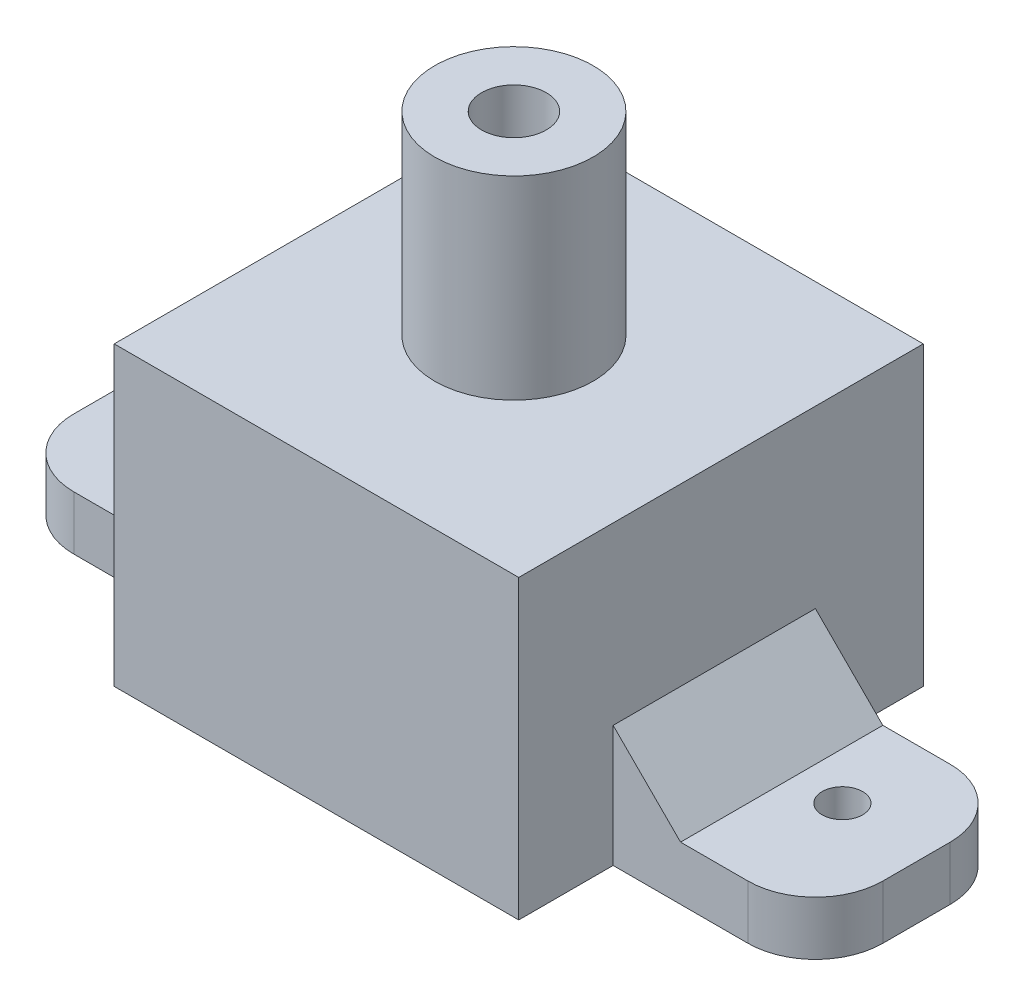
ISO-10303-21;
HEADER;
FILE_DESCRIPTION(('STEP AP214'),'2;1');
FILE_NAME('part.step','',(''),(''),'','','');
FILE_SCHEMA(('AUTOMOTIVE_DESIGN { 1 0 10303 214 1 1 1 1 }'));
ENDSEC;
DATA;
#1=APPLICATION_CONTEXT('core data for automotive mechanical design processes');
#2=APPLICATION_PROTOCOL_DEFINITION('international standard','automotive_design',2000,#1);
#3=PRODUCT_CONTEXT('',#1,'mechanical');
#4=PRODUCT('Part','Part','',(#3));
#5=PRODUCT_RELATED_PRODUCT_CATEGORY('part','',(#4));
#6=PRODUCT_DEFINITION_FORMATION('','',#4);
#7=PRODUCT_DEFINITION_CONTEXT('part definition',#1,'design');
#8=PRODUCT_DEFINITION('design','',#6,#7);
#9=PRODUCT_DEFINITION_SHAPE('','',#8);
#10=(LENGTH_UNIT() NAMED_UNIT(*) SI_UNIT(.MILLI.,.METRE.));
#11=(NAMED_UNIT(*) PLANE_ANGLE_UNIT() SI_UNIT($,.RADIAN.));
#12=(NAMED_UNIT(*) SI_UNIT($,.STERADIAN.) SOLID_ANGLE_UNIT());
#13=UNCERTAINTY_MEASURE_WITH_UNIT(LENGTH_MEASURE(1.E-05),#10,'distance_accuracy_value','');
#14=(GEOMETRIC_REPRESENTATION_CONTEXT(3) GLOBAL_UNCERTAINTY_ASSIGNED_CONTEXT((#13)) GLOBAL_UNIT_ASSIGNED_CONTEXT((#10,
#11,#12)) REPRESENTATION_CONTEXT('',''));
#15=CARTESIAN_POINT('',(0.,0.,0.));
#16=DIRECTION('',(0.,0.,1.));
#17=DIRECTION('',(1.,0.,0.));
#18=AXIS2_PLACEMENT_3D('',#15,#16,#17);
#19=CARTESIAN_POINT('',(-14.2865305436927,22.,-14.6432652718463));
#20=DIRECTION('',(1.,0.,0.));
#21=DIRECTION('',(0.,0.,-1.));
#22=AXIS2_PLACEMENT_3D('',#19,#20,#21);
#23=PLANE('',#22);
#24=DIRECTION('',(0.,0.,1.));
#25=VECTOR('',#24,1.);
#26=CARTESIAN_POINT('',(-14.2865305436927,9.00000000000004,-14.6432652718463));
#27=LINE('',#26,#25);
#28=CARTESIAN_POINT('',(-14.2865305436927,9.00000000000004,-6.64326527184634));
#29=VERTEX_POINT('',#28);
#30=CARTESIAN_POINT('',(-14.2865305436927,9.00000000000004,8.35673472815366));
#31=VERTEX_POINT('',#30);
#32=EDGE_CURVE('E378',#29,#31,#27,.T.);
#33=ORIENTED_EDGE('',*,*,#32,.T.);
#34=DIRECTION('',(0.,-1.,0.));
#35=VECTOR('',#34,1.);
#36=CARTESIAN_POINT('',(-14.2865305436927,4.,8.35673472815366));
#37=LINE('',#36,#35);
#38=CARTESIAN_POINT('',(-14.2865305436927,0.,8.35673472815366));
#39=VERTEX_POINT('',#38);
#40=EDGE_CURVE('E248',#31,#39,#37,.T.);
#41=ORIENTED_EDGE('',*,*,#40,.T.);
#42=DIRECTION('',(0.,0.,1.));
#43=VECTOR('',#42,1.);
#44=CARTESIAN_POINT('',(-14.2865305436927,0.,-14.6432652718463));
#45=LINE('',#44,#43);
#46=CARTESIAN_POINT('',(-14.2865305436927,0.,15.3567347281537));
#47=VERTEX_POINT('',#46);
#48=EDGE_CURVE('E308',#39,#47,#45,.T.);
#49=ORIENTED_EDGE('',*,*,#48,.T.);
#50=DIRECTION('',(0.,-1.,0.));
#51=VECTOR('',#50,1.);
#52=CARTESIAN_POINT('',(-14.2865305436927,22.,15.3567347281537));
#53=LINE('',#52,#51);
#54=CARTESIAN_POINT('',(-14.2865305436927,22.,15.3567347281537));
#55=VERTEX_POINT('',#54);
#56=EDGE_CURVE('E314',#55,#47,#53,.T.);
#57=ORIENTED_EDGE('',*,*,#56,.F.);
#58=DIRECTION('',(0.,0.,1.));
#59=VECTOR('',#58,1.);
#60=CARTESIAN_POINT('',(-14.2865305436927,22.,-14.6432652718463));
#61=LINE('',#60,#59);
#62=CARTESIAN_POINT('',(-14.2865305436927,22.,-14.6432652718463));
#63=VERTEX_POINT('',#62);
#64=EDGE_CURVE('E315',#63,#55,#61,.T.);
#65=ORIENTED_EDGE('',*,*,#64,.F.);
#66=DIRECTION('',(0.,-1.,0.));
#67=VECTOR('',#66,1.);
#68=CARTESIAN_POINT('',(-14.2865305436927,22.,-14.6432652718463));
#69=LINE('',#68,#67);
#70=CARTESIAN_POINT('',(-14.2865305436927,0.,-14.6432652718463));
#71=VERTEX_POINT('',#70);
#72=EDGE_CURVE('E329',#63,#71,#69,.T.);
#73=ORIENTED_EDGE('',*,*,#72,.T.);
#74=CARTESIAN_POINT('',(-14.2865305436927,0.,-6.64326527184634));
#75=VERTEX_POINT('',#74);
#76=EDGE_CURVE('E330',#71,#75,#45,.T.);
#77=ORIENTED_EDGE('',*,*,#76,.T.);
#78=DIRECTION('',(0.,-1.,0.));
#79=VECTOR('',#78,1.);
#80=CARTESIAN_POINT('',(-14.2865305436927,4.,-6.64326527184634));
#81=LINE('',#80,#79);
#82=EDGE_CURVE('E265',#29,#75,#81,.T.);
#83=ORIENTED_EDGE('',*,*,#82,.F.);
#84=EDGE_LOOP('',(#33,#41,#49,#57,#65,#73,#77,#83));
#85=FACE_BOUND('',#84,.T.);
#86=ADVANCED_FACE('F47',(#85),#23,.F.);
#87=CARTESIAN_POINT('',(15.7134694563073,22.,-14.6432652718463));
#88=DIRECTION('',(-1.,0.,0.));
#89=DIRECTION('',(0.,0.,1.));
#90=AXIS2_PLACEMENT_3D('',#87,#88,#89);
#91=PLANE('',#90);
#92=DIRECTION('',(0.,0.,-1.));
#93=VECTOR('',#92,1.);
#94=CARTESIAN_POINT('',(15.7134694563073,9.00000000000004,-14.6432652718463));
#95=LINE('',#94,#93);
#96=CARTESIAN_POINT('',(15.7134694563073,9.00000000000004,8.35673472815366));
#97=VERTEX_POINT('',#96);
#98=CARTESIAN_POINT('',(15.7134694563073,9.00000000000004,-6.64326527184634));
#99=VERTEX_POINT('',#98);
#100=EDGE_CURVE('E313',#97,#99,#95,.T.);
#101=ORIENTED_EDGE('',*,*,#100,.T.);
#102=DIRECTION('',(0.,-1.,0.));
#103=VECTOR('',#102,1.);
#104=CARTESIAN_POINT('',(15.7134694563073,4.,-6.64326527184634));
#105=LINE('',#104,#103);
#106=CARTESIAN_POINT('',(15.7134694563073,0.,-6.64326527184634));
#107=VERTEX_POINT('',#106);
#108=EDGE_CURVE('E195',#99,#107,#105,.T.);
#109=ORIENTED_EDGE('',*,*,#108,.T.);
#110=DIRECTION('',(0.,0.,-1.));
#111=VECTOR('',#110,1.);
#112=CARTESIAN_POINT('',(15.7134694563073,0.,-14.6432652718463));
#113=LINE('',#112,#111);
#114=CARTESIAN_POINT('',(15.7134694563073,0.,-14.6432652718463));
#115=VERTEX_POINT('',#114);
#116=EDGE_CURVE('E337',#107,#115,#113,.T.);
#117=ORIENTED_EDGE('',*,*,#116,.T.);
#118=DIRECTION('',(0.,-1.,0.));
#119=VECTOR('',#118,1.);
#120=CARTESIAN_POINT('',(15.7134694563073,22.,-14.6432652718463));
#121=LINE('',#120,#119);
#122=CARTESIAN_POINT('',(15.7134694563073,22.,-14.6432652718463));
#123=VERTEX_POINT('',#122);
#124=EDGE_CURVE('E347',#123,#115,#121,.T.);
#125=ORIENTED_EDGE('',*,*,#124,.F.);
#126=DIRECTION('',(0.,0.,-1.));
#127=VECTOR('',#126,1.);
#128=CARTESIAN_POINT('',(15.7134694563073,22.,-14.6432652718463));
#129=LINE('',#128,#127);
#130=CARTESIAN_POINT('',(15.7134694563073,22.,15.3567347281537));
#131=VERTEX_POINT('',#130);
#132=EDGE_CURVE('E323',#131,#123,#129,.T.);
#133=ORIENTED_EDGE('',*,*,#132,.F.);
#134=DIRECTION('',(0.,-1.,0.));
#135=VECTOR('',#134,1.);
#136=CARTESIAN_POINT('',(15.7134694563073,22.,15.3567347281537));
#137=LINE('',#136,#135);
#138=CARTESIAN_POINT('',(15.7134694563073,0.,15.3567347281537));
#139=VERTEX_POINT('',#138);
#140=EDGE_CURVE('E351',#131,#139,#137,.T.);
#141=ORIENTED_EDGE('',*,*,#140,.T.);
#142=CARTESIAN_POINT('',(15.7134694563073,0.,8.35673472815366));
#143=VERTEX_POINT('',#142);
#144=EDGE_CURVE('E338',#139,#143,#113,.T.);
#145=ORIENTED_EDGE('',*,*,#144,.T.);
#146=DIRECTION('',(0.,-1.,0.));
#147=VECTOR('',#146,1.);
#148=CARTESIAN_POINT('',(15.7134694563073,4.,8.35673472815366));
#149=LINE('',#148,#147);
#150=EDGE_CURVE('E233',#97,#143,#149,.T.);
#151=ORIENTED_EDGE('',*,*,#150,.F.);
#152=EDGE_LOOP('',(#101,#109,#117,#125,#133,#141,#145,#151));
#153=FACE_BOUND('',#152,.T.);
#154=ADVANCED_FACE('F428',(#153),#91,.F.);
#155=CARTESIAN_POINT('',(-14.2865305436927,22.,15.3567347281537));
#156=DIRECTION('',(0.,0.,-1.));
#157=DIRECTION('',(-1.,0.,0.));
#158=AXIS2_PLACEMENT_3D('',#155,#156,#157);
#159=PLANE('',#158);
#160=DIRECTION('',(1.,0.,0.));
#161=VECTOR('',#160,1.);
#162=CARTESIAN_POINT('',(-14.2865305436927,0.,15.3567347281537));
#163=LINE('',#162,#161);
#164=EDGE_CURVE('E334',#47,#139,#163,.T.);
#165=ORIENTED_EDGE('',*,*,#164,.T.);
#166=ORIENTED_EDGE('',*,*,#140,.F.);
#167=DIRECTION('',(1.,0.,0.));
#168=VECTOR('',#167,1.);
#169=CARTESIAN_POINT('',(-14.2865305436927,22.,15.3567347281537));
#170=LINE('',#169,#168);
#171=EDGE_CURVE('E319',#55,#131,#170,.T.);
#172=ORIENTED_EDGE('',*,*,#171,.F.);
#173=ORIENTED_EDGE('',*,*,#56,.T.);
#174=EDGE_LOOP('',(#165,#166,#172,#173));
#175=FACE_BOUND('',#174,.T.);
#176=ADVANCED_FACE('F397',(#175),#159,.F.);
#177=CARTESIAN_POINT('',(-14.2865305436927,22.,-14.6432652718463));
#178=DIRECTION('',(0.,0.,1.));
#179=DIRECTION('',(1.,0.,0.));
#180=AXIS2_PLACEMENT_3D('',#177,#178,#179);
#181=PLANE('',#180);
#182=DIRECTION('',(-1.,0.,0.));
#183=VECTOR('',#182,1.);
#184=CARTESIAN_POINT('',(-14.2865305436927,0.,-14.6432652718463));
#185=LINE('',#184,#183);
#186=EDGE_CURVE('E320',#115,#71,#185,.T.);
#187=ORIENTED_EDGE('',*,*,#186,.T.);
#188=ORIENTED_EDGE('',*,*,#72,.F.);
#189=DIRECTION('',(-1.,0.,0.));
#190=VECTOR('',#189,1.);
#191=CARTESIAN_POINT('',(-14.2865305436927,22.,-14.6432652718463));
#192=LINE('',#191,#190);
#193=EDGE_CURVE('E326',#123,#63,#192,.T.);
#194=ORIENTED_EDGE('',*,*,#193,.F.);
#195=ORIENTED_EDGE('',*,*,#124,.T.);
#196=EDGE_LOOP('',(#187,#188,#194,#195));
#197=FACE_BOUND('',#196,.T.);
#198=ADVANCED_FACE('F443',(#197),#181,.F.);
#199=CARTESIAN_POINT('',(0.,22.,0.));
#200=DIRECTION('',(0.,1.,0.));
#201=DIRECTION('',(0.,0.,1.));
#202=AXIS2_PLACEMENT_3D('',#199,#200,#201);
#203=PLANE('',#202);
#204=CARTESIAN_POINT('',(0.,22.,0.));
#205=DIRECTION('',(0.,1.,0.));
#206=DIRECTION('',(0.,0.,1.));
#207=AXIS2_PLACEMENT_3D('',#204,#205,#206);
#208=CIRCLE('',#207,5.875);
#209=CARTESIAN_POINT('',(0.,22.,5.875));
#210=VERTEX_POINT('',#209);
#211=EDGE_CURVE('E309',#210,#210,#208,.T.);
#212=ORIENTED_EDGE('',*,*,#211,.F.);
#213=EDGE_LOOP('',(#212));
#214=FACE_BOUND('',#213,.T.);
#215=ORIENTED_EDGE('',*,*,#64,.T.);
#216=ORIENTED_EDGE('',*,*,#171,.T.);
#217=ORIENTED_EDGE('',*,*,#132,.T.);
#218=ORIENTED_EDGE('',*,*,#193,.T.);
#219=EDGE_LOOP('',(#215,#216,#217,#218));
#220=FACE_BOUND('',#219,.T.);
#221=ADVANCED_FACE('F400',(#214,#220),#203,.T.);
#222=CARTESIAN_POINT('',(0.,0.,0.));
#223=DIRECTION('',(0.,1.,0.));
#224=DIRECTION('',(0.,0.,1.));
#225=AXIS2_PLACEMENT_3D('',#222,#223,#224);
#226=PLANE('',#225);
#227=CARTESIAN_POINT('',(-22.7865305436927,0.,-0.143265271846341));
#228=DIRECTION('',(0.,1.,0.));
#229=DIRECTION('',(0.,0.,1.));
#230=AXIS2_PLACEMENT_3D('',#227,#228,#229);
#231=CIRCLE('',#230,1.5);
#232=CARTESIAN_POINT('',(-22.7865305436927,0.,1.35673472815366));
#233=VERTEX_POINT('',#232);
#234=EDGE_CURVE('E362',#233,#233,#231,.T.);
#235=ORIENTED_EDGE('',*,*,#234,.T.);
#236=EDGE_LOOP('',(#235));
#237=FACE_BOUND('',#236,.T.);
#238=CARTESIAN_POINT('',(24.2134694563074,0.,-0.143265271846338));
#239=DIRECTION('',(0.,1.,0.));
#240=DIRECTION('',(0.,0.,1.));
#241=AXIS2_PLACEMENT_3D('',#238,#239,#240);
#242=CIRCLE('',#241,1.5);
#243=CARTESIAN_POINT('',(24.2134694563074,0.,1.35673472815366));
#244=VERTEX_POINT('',#243);
#245=EDGE_CURVE('E513',#244,#244,#242,.T.);
#246=ORIENTED_EDGE('',*,*,#245,.T.);
#247=EDGE_LOOP('',(#246));
#248=FACE_BOUND('',#247,.T.);
#249=ORIENTED_EDGE('',*,*,#76,.F.);
#250=ORIENTED_EDGE('',*,*,#186,.F.);
#251=ORIENTED_EDGE('',*,*,#116,.F.);
#252=DIRECTION('',(1.,0.,0.));
#253=VECTOR('',#252,1.);
#254=CARTESIAN_POINT('',(15.7134694563073,0.,-6.64326527184634));
#255=LINE('',#254,#253);
#256=CARTESIAN_POINT('',(25.7134694563073,0.,-6.64326527184634));
#257=VERTEX_POINT('',#256);
#258=EDGE_CURVE('E216',#107,#257,#255,.T.);
#259=ORIENTED_EDGE('',*,*,#258,.T.);
#260=CARTESIAN_POINT('',(25.7134694563073,0.,-1.64326527184634));
#261=DIRECTION('',(0.,-1.,0.));
#262=DIRECTION('',(0.,0.,1.));
#263=AXIS2_PLACEMENT_3D('',#260,#261,#262);
#264=CIRCLE('',#263,5.);
#265=CARTESIAN_POINT('',(30.7134694563074,0.,-1.6432652718463));
#266=VERTEX_POINT('',#265);
#267=EDGE_CURVE('E191',#257,#266,#264,.T.);
#268=ORIENTED_EDGE('',*,*,#267,.T.);
#269=DIRECTION('',(0.,0.,1.));
#270=VECTOR('',#269,1.);
#271=CARTESIAN_POINT('',(30.7134694563074,0.,3.35673472815363));
#272=LINE('',#271,#270);
#273=CARTESIAN_POINT('',(30.7134694563074,0.,3.35673472815363));
#274=VERTEX_POINT('',#273);
#275=EDGE_CURVE('E222',#266,#274,#272,.T.);
#276=ORIENTED_EDGE('',*,*,#275,.T.);
#277=CARTESIAN_POINT('',(25.7134694563073,0.,3.35673472815366));
#278=DIRECTION('',(0.,-1.,0.));
#279=DIRECTION('',(0.,0.,-1.));
#280=AXIS2_PLACEMENT_3D('',#277,#278,#279);
#281=CIRCLE('',#280,5.);
#282=CARTESIAN_POINT('',(25.7134694563073,0.,8.35673472815366));
#283=VERTEX_POINT('',#282);
#284=EDGE_CURVE('E226',#274,#283,#281,.T.);
#285=ORIENTED_EDGE('',*,*,#284,.T.);
#286=DIRECTION('',(-1.,0.,0.));
#287=VECTOR('',#286,1.);
#288=CARTESIAN_POINT('',(15.7134694563073,0.,8.35673472815366));
#289=LINE('',#288,#287);
#290=EDGE_CURVE('E185',#283,#143,#289,.T.);
#291=ORIENTED_EDGE('',*,*,#290,.T.);
#292=ORIENTED_EDGE('',*,*,#144,.F.);
#293=ORIENTED_EDGE('',*,*,#164,.F.);
#294=ORIENTED_EDGE('',*,*,#48,.F.);
#295=DIRECTION('',(-1.,0.,0.));
#296=VECTOR('',#295,1.);
#297=CARTESIAN_POINT('',(-14.2865305436927,0.,8.35673472815366));
#298=LINE('',#297,#296);
#299=CARTESIAN_POINT('',(-24.2865305436926,0.,8.35673472815366));
#300=VERTEX_POINT('',#299);
#301=EDGE_CURVE('E219',#39,#300,#298,.T.);
#302=ORIENTED_EDGE('',*,*,#301,.T.);
#303=CARTESIAN_POINT('',(-24.2865305436927,0.,3.35673472815366));
#304=DIRECTION('',(0.,-1.,0.));
#305=DIRECTION('',(0.,0.,1.));
#306=AXIS2_PLACEMENT_3D('',#303,#304,#305);
#307=CIRCLE('',#306,5.);
#308=CARTESIAN_POINT('',(-29.2865305436927,0.,3.35673472815363));
#309=VERTEX_POINT('',#308);
#310=EDGE_CURVE('E282',#300,#309,#307,.T.);
#311=ORIENTED_EDGE('',*,*,#310,.T.);
#312=DIRECTION('',(0.,0.,-1.));
#313=VECTOR('',#312,1.);
#314=CARTESIAN_POINT('',(-29.2865305436927,0.,3.35673472815362));
#315=LINE('',#314,#313);
#316=CARTESIAN_POINT('',(-29.2865305436927,0.,-1.64326527184631));
#317=VERTEX_POINT('',#316);
#318=EDGE_CURVE('E278',#309,#317,#315,.T.);
#319=ORIENTED_EDGE('',*,*,#318,.T.);
#320=CARTESIAN_POINT('',(-24.2865305436927,0.,-1.64326527184634));
#321=DIRECTION('',(0.,-1.,0.));
#322=DIRECTION('',(0.,0.,1.));
#323=AXIS2_PLACEMENT_3D('',#320,#321,#322);
#324=CIRCLE('',#323,5.);
#325=CARTESIAN_POINT('',(-24.2865305436926,0.,-6.64326527184634));
#326=VERTEX_POINT('',#325);
#327=EDGE_CURVE('E273',#317,#326,#324,.T.);
#328=ORIENTED_EDGE('',*,*,#327,.T.);
#329=DIRECTION('',(1.,0.,0.));
#330=VECTOR('',#329,1.);
#331=CARTESIAN_POINT('',(-14.2865305436927,0.,-6.64326527184634));
#332=LINE('',#331,#330);
#333=EDGE_CURVE('E269',#326,#75,#332,.T.);
#334=ORIENTED_EDGE('',*,*,#333,.T.);
#335=EDGE_LOOP('',(#249,#250,#251,#259,#268,#276,#285,#291,#292,#293,#294,#302,#311,#319,#328,#334));
#336=FACE_BOUND('',#335,.T.);
#337=ADVANCED_FACE('F394',(#237,#248,#336),#226,.F.);
#338=CARTESIAN_POINT('',(0.,36.4,0.));
#339=DIRECTION('',(0.,-1.,0.));
#340=DIRECTION('',(0.,0.,-1.));
#341=AXIS2_PLACEMENT_3D('',#338,#339,#340);
#342=CYLINDRICAL_SURFACE('',#341,5.875);
#343=CARTESIAN_POINT('',(0.,36.4,0.));
#344=DIRECTION('',(0.,1.,0.));
#345=DIRECTION('',(0.,0.,1.));
#346=AXIS2_PLACEMENT_3D('',#343,#344,#345);
#347=CIRCLE('',#346,5.875);
#348=CARTESIAN_POINT('',(0.,36.4,5.875));
#349=VERTEX_POINT('',#348);
#350=EDGE_CURVE('E236',#349,#349,#347,.T.);
#351=ORIENTED_EDGE('',*,*,#350,.F.);
#352=EDGE_LOOP('',(#351));
#353=FACE_BOUND('',#352,.T.);
#354=ORIENTED_EDGE('',*,*,#211,.T.);
#355=EDGE_LOOP('',(#354));
#356=FACE_BOUND('',#355,.T.);
#357=ADVANCED_FACE('F449',(#353,#356),#342,.T.);
#358=CARTESIAN_POINT('',(0.,36.4,0.));
#359=DIRECTION('',(0.,1.,0.));
#360=DIRECTION('',(0.,0.,1.));
#361=AXIS2_PLACEMENT_3D('',#358,#359,#360);
#362=PLANE('',#361);
#363=CARTESIAN_POINT('',(0.,36.4,0.));
#364=DIRECTION('',(0.,1.,0.));
#365=DIRECTION('',(0.,0.,1.));
#366=AXIS2_PLACEMENT_3D('',#363,#364,#365);
#367=CIRCLE('',#366,2.4);
#368=CARTESIAN_POINT('',(0.,36.4,2.4));
#369=VERTEX_POINT('',#368);
#370=EDGE_CURVE('E514',#369,#369,#367,.T.);
#371=ORIENTED_EDGE('',*,*,#370,.F.);
#372=EDGE_LOOP('',(#371));
#373=FACE_BOUND('',#372,.T.);
#374=ORIENTED_EDGE('',*,*,#350,.T.);
#375=EDGE_LOOP('',(#374));
#376=FACE_BOUND('',#375,.T.);
#377=ADVANCED_FACE('F456',(#373,#376),#362,.T.);
#378=CARTESIAN_POINT('',(15.7134694563073,4.,8.35673472815366));
#379=DIRECTION('',(0.,0.,1.));
#380=DIRECTION('',(1.,0.,0.));
#381=AXIS2_PLACEMENT_3D('',#378,#379,#380);
#382=PLANE('',#381);
#383=ORIENTED_EDGE('',*,*,#290,.F.);
#384=DIRECTION('',(0.,-1.,0.));
#385=VECTOR('',#384,1.);
#386=CARTESIAN_POINT('',(25.7134694563073,4.,8.35673472815366));
#387=LINE('',#386,#385);
#388=CARTESIAN_POINT('',(25.7134694563073,4.,8.35673472815366));
#389=VERTEX_POINT('',#388);
#390=EDGE_CURVE('E237',#389,#283,#387,.T.);
#391=ORIENTED_EDGE('',*,*,#390,.F.);
#392=DIRECTION('',(-1.,0.,0.));
#393=VECTOR('',#392,1.);
#394=CARTESIAN_POINT('',(15.7134694563073,4.,8.35673472815366));
#395=LINE('',#394,#393);
#396=CARTESIAN_POINT('',(20.7134694563073,4.,8.35673472815366));
#397=VERTEX_POINT('',#396);
#398=EDGE_CURVE('E212',#389,#397,#395,.T.);
#399=ORIENTED_EDGE('',*,*,#398,.T.);
#400=DIRECTION('',(-0.707106781186543,0.707106781186552,0.));
#401=VECTOR('',#400,1.);
#402=CARTESIAN_POINT('',(15.7134694563073,9.00000000000004,8.35673472815366));
#403=LINE('',#402,#401);
#404=EDGE_CURVE('E374',#397,#97,#403,.T.);
#405=ORIENTED_EDGE('',*,*,#404,.T.);
#406=ORIENTED_EDGE('',*,*,#150,.T.);
#407=EDGE_LOOP('',(#383,#391,#399,#405,#406));
#408=FACE_BOUND('',#407,.T.);
#409=ADVANCED_FACE('F459',(#408),#382,.T.);
#410=CARTESIAN_POINT('',(25.7134694563073,4.,3.35673472815366));
#411=DIRECTION('',(0.,-1.,0.));
#412=DIRECTION('',(0.,0.,-1.));
#413=AXIS2_PLACEMENT_3D('',#410,#411,#412);
#414=CYLINDRICAL_SURFACE('',#413,5.);
#415=ORIENTED_EDGE('',*,*,#284,.F.);
#416=DIRECTION('',(0.,-1.,0.));
#417=VECTOR('',#416,1.);
#418=CARTESIAN_POINT('',(30.7134694563074,4.,3.35673472815363));
#419=LINE('',#418,#417);
#420=CARTESIAN_POINT('',(30.7134694563074,4.,3.35673472815363));
#421=VERTEX_POINT('',#420);
#422=EDGE_CURVE('E240',#421,#274,#419,.T.);
#423=ORIENTED_EDGE('',*,*,#422,.F.);
#424=CARTESIAN_POINT('',(25.7134694563073,4.,3.35673472815366));
#425=DIRECTION('',(0.,-1.,0.));
#426=DIRECTION('',(0.,0.,-1.));
#427=AXIS2_PLACEMENT_3D('',#424,#425,#426);
#428=CIRCLE('',#427,5.);
#429=EDGE_CURVE('E205',#421,#389,#428,.T.);
#430=ORIENTED_EDGE('',*,*,#429,.T.);
#431=ORIENTED_EDGE('',*,*,#390,.T.);
#432=EDGE_LOOP('',(#415,#423,#430,#431));
#433=FACE_BOUND('',#432,.T.);
#434=ADVANCED_FACE('F488',(#433),#414,.T.);
#435=CARTESIAN_POINT('',(30.7134694563074,4.,3.35673472815363));
#436=DIRECTION('',(1.,0.,0.));
#437=DIRECTION('',(0.,0.,-1.));
#438=AXIS2_PLACEMENT_3D('',#435,#436,#437);
#439=PLANE('',#438);
#440=ORIENTED_EDGE('',*,*,#275,.F.);
#441=DIRECTION('',(0.,-1.,0.));
#442=VECTOR('',#441,1.);
#443=CARTESIAN_POINT('',(30.7134694563074,4.,-1.6432652718463));
#444=LINE('',#443,#442);
#445=CARTESIAN_POINT('',(30.7134694563074,4.,-1.6432652718463));
#446=VERTEX_POINT('',#445);
#447=EDGE_CURVE('E194',#446,#266,#444,.T.);
#448=ORIENTED_EDGE('',*,*,#447,.F.);
#449=DIRECTION('',(0.,0.,1.));
#450=VECTOR('',#449,1.);
#451=CARTESIAN_POINT('',(30.7134694563074,4.,3.35673472815363));
#452=LINE('',#451,#450);
#453=EDGE_CURVE('E201',#446,#421,#452,.T.);
#454=ORIENTED_EDGE('',*,*,#453,.T.);
#455=ORIENTED_EDGE('',*,*,#422,.T.);
#456=EDGE_LOOP('',(#440,#448,#454,#455));
#457=FACE_BOUND('',#456,.T.);
#458=ADVANCED_FACE('F485',(#457),#439,.T.);
#459=CARTESIAN_POINT('',(25.7134694563073,4.,-1.64326527184634));
#460=DIRECTION('',(0.,-1.,0.));
#461=DIRECTION('',(0.,0.,-1.));
#462=AXIS2_PLACEMENT_3D('',#459,#460,#461);
#463=CYLINDRICAL_SURFACE('',#462,5.);
#464=ORIENTED_EDGE('',*,*,#267,.F.);
#465=DIRECTION('',(0.,-1.,0.));
#466=VECTOR('',#465,1.);
#467=CARTESIAN_POINT('',(25.7134694563073,4.,-6.64326527184634));
#468=LINE('',#467,#466);
#469=CARTESIAN_POINT('',(25.7134694563073,4.,-6.64326527184634));
#470=VERTEX_POINT('',#469);
#471=EDGE_CURVE('E176',#470,#257,#468,.T.);
#472=ORIENTED_EDGE('',*,*,#471,.F.);
#473=CARTESIAN_POINT('',(25.7134694563073,4.,-1.64326527184634));
#474=DIRECTION('',(0.,-1.,0.));
#475=DIRECTION('',(0.,0.,1.));
#476=AXIS2_PLACEMENT_3D('',#473,#474,#475);
#477=CIRCLE('',#476,5.);
#478=EDGE_CURVE('E184',#470,#446,#477,.T.);
#479=ORIENTED_EDGE('',*,*,#478,.T.);
#480=ORIENTED_EDGE('',*,*,#447,.T.);
#481=EDGE_LOOP('',(#464,#472,#479,#480));
#482=FACE_BOUND('',#481,.T.);
#483=ADVANCED_FACE('F189',(#482),#463,.T.);
#484=CARTESIAN_POINT('',(15.7134694563073,4.,-6.64326527184634));
#485=DIRECTION('',(0.,0.,-1.));
#486=DIRECTION('',(-1.,0.,0.));
#487=AXIS2_PLACEMENT_3D('',#484,#485,#486);
#488=PLANE('',#487);
#489=ORIENTED_EDGE('',*,*,#258,.F.);
#490=ORIENTED_EDGE('',*,*,#108,.F.);
#491=DIRECTION('',(0.707106781186543,-0.707106781186552,0.));
#492=VECTOR('',#491,1.);
#493=CARTESIAN_POINT('',(15.7134694563073,9.00000000000004,-6.64326527184634));
#494=LINE('',#493,#492);
#495=CARTESIAN_POINT('',(20.7134694563073,4.,-6.64326527184634));
#496=VERTEX_POINT('',#495);
#497=EDGE_CURVE('E179',#99,#496,#494,.T.);
#498=ORIENTED_EDGE('',*,*,#497,.T.);
#499=DIRECTION('',(1.,0.,0.));
#500=VECTOR('',#499,1.);
#501=CARTESIAN_POINT('',(15.7134694563073,4.,-6.64326527184634));
#502=LINE('',#501,#500);
#503=EDGE_CURVE('E173',#496,#470,#502,.T.);
#504=ORIENTED_EDGE('',*,*,#503,.T.);
#505=ORIENTED_EDGE('',*,*,#471,.T.);
#506=EDGE_LOOP('',(#489,#490,#498,#504,#505));
#507=FACE_BOUND('',#506,.T.);
#508=ADVANCED_FACE('F175',(#507),#488,.T.);
#509=CARTESIAN_POINT('',(25.7134694563073,4.,-1.64326527184634));
#510=DIRECTION('',(0.,1.,0.));
#511=DIRECTION('',(0.,0.,1.));
#512=AXIS2_PLACEMENT_3D('',#509,#510,#511);
#513=PLANE('',#512);
#514=CARTESIAN_POINT('',(24.2134694563074,4.,-0.143265271846338));
#515=DIRECTION('',(0.,1.,0.));
#516=DIRECTION('',(0.,0.,1.));
#517=AXIS2_PLACEMENT_3D('',#514,#515,#516);
#518=CIRCLE('',#517,1.5);
#519=CARTESIAN_POINT('',(24.2134694563074,4.,1.35673472815366));
#520=VERTEX_POINT('',#519);
#521=EDGE_CURVE('E268',#520,#520,#518,.T.);
#522=ORIENTED_EDGE('',*,*,#521,.F.);
#523=EDGE_LOOP('',(#522));
#524=FACE_BOUND('',#523,.T.);
#525=ORIENTED_EDGE('',*,*,#503,.F.);
#526=DIRECTION('',(0.,0.,1.));
#527=VECTOR('',#526,1.);
#528=CARTESIAN_POINT('',(20.7134694563073,4.,-1.64326527184634));
#529=LINE('',#528,#527);
#530=EDGE_CURVE('E369',#496,#397,#529,.T.);
#531=ORIENTED_EDGE('',*,*,#530,.T.);
#532=ORIENTED_EDGE('',*,*,#398,.F.);
#533=ORIENTED_EDGE('',*,*,#429,.F.);
#534=ORIENTED_EDGE('',*,*,#453,.F.);
#535=ORIENTED_EDGE('',*,*,#478,.F.);
#536=EDGE_LOOP('',(#525,#531,#532,#533,#534,#535));
#537=FACE_BOUND('',#536,.T.);
#538=ADVANCED_FACE('F198',(#524,#537),#513,.T.);
#539=CARTESIAN_POINT('',(-14.2865305436927,4.,-6.64326527184634));
#540=DIRECTION('',(0.,0.,-1.));
#541=DIRECTION('',(-1.,0.,0.));
#542=AXIS2_PLACEMENT_3D('',#539,#540,#541);
#543=PLANE('',#542);
#544=ORIENTED_EDGE('',*,*,#333,.F.);
#545=DIRECTION('',(0.,-1.,0.));
#546=VECTOR('',#545,1.);
#547=CARTESIAN_POINT('',(-24.2865305436926,4.,-6.64326527184634));
#548=LINE('',#547,#546);
#549=CARTESIAN_POINT('',(-24.2865305436926,4.,-6.64326527184634));
#550=VERTEX_POINT('',#549);
#551=EDGE_CURVE('E262',#550,#326,#548,.T.);
#552=ORIENTED_EDGE('',*,*,#551,.F.);
#553=DIRECTION('',(1.,0.,0.));
#554=VECTOR('',#553,1.);
#555=CARTESIAN_POINT('',(-14.2865305436927,4.,-6.64326527184634));
#556=LINE('',#555,#554);
#557=CARTESIAN_POINT('',(-19.2865305436926,4.,-6.64326527184634));
#558=VERTEX_POINT('',#557);
#559=EDGE_CURVE('E252',#550,#558,#556,.T.);
#560=ORIENTED_EDGE('',*,*,#559,.T.);
#561=DIRECTION('',(0.707106781186544,0.707106781186551,0.));
#562=VECTOR('',#561,1.);
#563=CARTESIAN_POINT('',(-14.2865305436927,9.00000000000004,-6.64326527184634));
#564=LINE('',#563,#562);
#565=EDGE_CURVE('E11',#558,#29,#564,.T.);
#566=ORIENTED_EDGE('',*,*,#565,.T.);
#567=ORIENTED_EDGE('',*,*,#82,.T.);
#568=EDGE_LOOP('',(#544,#552,#560,#566,#567));
#569=FACE_BOUND('',#568,.T.);
#570=ADVANCED_FACE('F409',(#569),#543,.T.);
#571=CARTESIAN_POINT('',(-24.2865305436927,4.,-1.64326527184634));
#572=DIRECTION('',(0.,-1.,0.));
#573=DIRECTION('',(0.,0.,-1.));
#574=AXIS2_PLACEMENT_3D('',#571,#572,#573);
#575=CYLINDRICAL_SURFACE('',#574,5.);
#576=ORIENTED_EDGE('',*,*,#327,.F.);
#577=DIRECTION('',(0.,-1.,0.));
#578=VECTOR('',#577,1.);
#579=CARTESIAN_POINT('',(-29.2865305436927,4.,-1.64326527184631));
#580=LINE('',#579,#578);
#581=CARTESIAN_POINT('',(-29.2865305436927,4.,-1.64326527184631));
#582=VERTEX_POINT('',#581);
#583=EDGE_CURVE('E259',#582,#317,#580,.T.);
#584=ORIENTED_EDGE('',*,*,#583,.F.);
#585=CARTESIAN_POINT('',(-24.2865305436927,4.,-1.64326527184634));
#586=DIRECTION('',(0.,-1.,0.));
#587=DIRECTION('',(0.,0.,1.));
#588=AXIS2_PLACEMENT_3D('',#585,#586,#587);
#589=CIRCLE('',#588,5.);
#590=EDGE_CURVE('E291',#582,#550,#589,.T.);
#591=ORIENTED_EDGE('',*,*,#590,.T.);
#592=ORIENTED_EDGE('',*,*,#551,.T.);
#593=EDGE_LOOP('',(#576,#584,#591,#592));
#594=FACE_BOUND('',#593,.T.);
#595=ADVANCED_FACE('F467',(#594),#575,.T.);
#596=CARTESIAN_POINT('',(-29.2865305436927,4.,3.35673472815362));
#597=DIRECTION('',(-1.,0.,0.));
#598=DIRECTION('',(0.,0.,1.));
#599=AXIS2_PLACEMENT_3D('',#596,#597,#598);
#600=PLANE('',#599);
#601=ORIENTED_EDGE('',*,*,#318,.F.);
#602=DIRECTION('',(0.,-1.,0.));
#603=VECTOR('',#602,1.);
#604=CARTESIAN_POINT('',(-29.2865305436927,4.,3.35673472815363));
#605=LINE('',#604,#603);
#606=CARTESIAN_POINT('',(-29.2865305436927,4.,3.35673472815363));
#607=VERTEX_POINT('',#606);
#608=EDGE_CURVE('E256',#607,#309,#605,.T.);
#609=ORIENTED_EDGE('',*,*,#608,.F.);
#610=DIRECTION('',(0.,0.,-1.));
#611=VECTOR('',#610,1.);
#612=CARTESIAN_POINT('',(-29.2865305436927,4.,3.35673472815362));
#613=LINE('',#612,#611);
#614=EDGE_CURVE('E295',#607,#582,#613,.T.);
#615=ORIENTED_EDGE('',*,*,#614,.T.);
#616=ORIENTED_EDGE('',*,*,#583,.T.);
#617=EDGE_LOOP('',(#601,#609,#615,#616));
#618=FACE_BOUND('',#617,.T.);
#619=ADVANCED_FACE('F470',(#618),#600,.T.);
#620=CARTESIAN_POINT('',(-24.2865305436927,4.,3.35673472815366));
#621=DIRECTION('',(0.,-1.,0.));
#622=DIRECTION('',(0.,0.,-1.));
#623=AXIS2_PLACEMENT_3D('',#620,#621,#622);
#624=CYLINDRICAL_SURFACE('',#623,5.);
#625=ORIENTED_EDGE('',*,*,#310,.F.);
#626=DIRECTION('',(0.,-1.,0.));
#627=VECTOR('',#626,1.);
#628=CARTESIAN_POINT('',(-24.2865305436926,4.,8.35673472815366));
#629=LINE('',#628,#627);
#630=CARTESIAN_POINT('',(-24.2865305436926,4.,8.35673472815366));
#631=VERTEX_POINT('',#630);
#632=EDGE_CURVE('E253',#631,#300,#629,.T.);
#633=ORIENTED_EDGE('',*,*,#632,.F.);
#634=CARTESIAN_POINT('',(-24.2865305436927,4.,3.35673472815366));
#635=DIRECTION('',(0.,-1.,0.));
#636=DIRECTION('',(0.,0.,1.));
#637=AXIS2_PLACEMENT_3D('',#634,#635,#636);
#638=CIRCLE('',#637,5.);
#639=EDGE_CURVE('E299',#631,#607,#638,.T.);
#640=ORIENTED_EDGE('',*,*,#639,.T.);
#641=ORIENTED_EDGE('',*,*,#608,.T.);
#642=EDGE_LOOP('',(#625,#633,#640,#641));
#643=FACE_BOUND('',#642,.T.);
#644=ADVANCED_FACE('F474',(#643),#624,.T.);
#645=CARTESIAN_POINT('',(-14.2865305436927,4.,8.35673472815366));
#646=DIRECTION('',(0.,0.,1.));
#647=DIRECTION('',(1.,0.,0.));
#648=AXIS2_PLACEMENT_3D('',#645,#646,#647);
#649=PLANE('',#648);
#650=ORIENTED_EDGE('',*,*,#301,.F.);
#651=ORIENTED_EDGE('',*,*,#40,.F.);
#652=DIRECTION('',(-0.707106781186544,-0.707106781186551,0.));
#653=VECTOR('',#652,1.);
#654=CARTESIAN_POINT('',(-14.2865305436927,9.00000000000004,8.35673472815366));
#655=LINE('',#654,#653);
#656=CARTESIAN_POINT('',(-19.2865305436926,4.,8.35673472815366));
#657=VERTEX_POINT('',#656);
#658=EDGE_CURVE('E57',#31,#657,#655,.T.);
#659=ORIENTED_EDGE('',*,*,#658,.T.);
#660=DIRECTION('',(-1.,0.,0.));
#661=VECTOR('',#660,1.);
#662=CARTESIAN_POINT('',(-14.2865305436927,4.,8.35673472815366));
#663=LINE('',#662,#661);
#664=EDGE_CURVE('E274',#657,#631,#663,.T.);
#665=ORIENTED_EDGE('',*,*,#664,.T.);
#666=ORIENTED_EDGE('',*,*,#632,.T.);
#667=EDGE_LOOP('',(#650,#651,#659,#665,#666));
#668=FACE_BOUND('',#667,.T.);
#669=ADVANCED_FACE('F464',(#668),#649,.T.);
#670=CARTESIAN_POINT('',(-24.2865305436927,4.,-1.64326527184634));
#671=DIRECTION('',(0.,1.,0.));
#672=DIRECTION('',(0.,0.,1.));
#673=AXIS2_PLACEMENT_3D('',#670,#671,#672);
#674=PLANE('',#673);
#675=CARTESIAN_POINT('',(-22.7865305436927,4.,-0.143265271846341));
#676=DIRECTION('',(0.,1.,0.));
#677=DIRECTION('',(0.,0.,1.));
#678=AXIS2_PLACEMENT_3D('',#675,#676,#677);
#679=CIRCLE('',#678,1.5);
#680=CARTESIAN_POINT('',(-22.7865305436927,4.,1.35673472815366));
#681=VERTEX_POINT('',#680);
#682=EDGE_CURVE('E358',#681,#681,#679,.T.);
#683=ORIENTED_EDGE('',*,*,#682,.F.);
#684=EDGE_LOOP('',(#683));
#685=FACE_BOUND('',#684,.T.);
#686=ORIENTED_EDGE('',*,*,#664,.F.);
#687=DIRECTION('',(0.,0.,-1.));
#688=VECTOR('',#687,1.);
#689=CARTESIAN_POINT('',(-19.2865305436926,4.,-1.64326527184634));
#690=LINE('',#689,#688);
#691=EDGE_CURVE('E70',#657,#558,#690,.T.);
#692=ORIENTED_EDGE('',*,*,#691,.T.);
#693=ORIENTED_EDGE('',*,*,#559,.F.);
#694=ORIENTED_EDGE('',*,*,#590,.F.);
#695=ORIENTED_EDGE('',*,*,#614,.F.);
#696=ORIENTED_EDGE('',*,*,#639,.F.);
#697=EDGE_LOOP('',(#686,#692,#693,#694,#695,#696));
#698=FACE_BOUND('',#697,.T.);
#699=ADVANCED_FACE('F461',(#685,#698),#674,.T.);
#700=CARTESIAN_POINT('',(-22.7865305436927,0.,-0.143265271846341));
#701=DIRECTION('',(0.,1.,0.));
#702=DIRECTION('',(0.,0.,1.));
#703=AXIS2_PLACEMENT_3D('',#700,#701,#702);
#704=CYLINDRICAL_SURFACE('',#703,1.5);
#705=ORIENTED_EDGE('',*,*,#682,.T.);
#706=EDGE_LOOP('',(#705));
#707=FACE_BOUND('',#706,.T.);
#708=ORIENTED_EDGE('',*,*,#234,.F.);
#709=EDGE_LOOP('',(#708));
#710=FACE_BOUND('',#709,.T.);
#711=ADVANCED_FACE('F463',(#707,#710),#704,.F.);
#712=CARTESIAN_POINT('',(24.2134694563074,0.,-0.143265271846338));
#713=DIRECTION('',(0.,1.,0.));
#714=DIRECTION('',(0.,0.,1.));
#715=AXIS2_PLACEMENT_3D('',#712,#713,#714);
#716=CYLINDRICAL_SURFACE('',#715,1.5);
#717=ORIENTED_EDGE('',*,*,#521,.T.);
#718=EDGE_LOOP('',(#717));
#719=FACE_BOUND('',#718,.T.);
#720=ORIENTED_EDGE('',*,*,#245,.F.);
#721=EDGE_LOOP('',(#720));
#722=FACE_BOUND('',#721,.T.);
#723=ADVANCED_FACE('F425',(#719,#722),#716,.F.);
#724=CARTESIAN_POINT('',(15.7134694563073,9.00000000000004,-14.6432652718463));
#725=DIRECTION('',(-0.707106781186552,-0.707106781186543,0.));
#726=DIRECTION('',(0.,0.,-1.));
#727=AXIS2_PLACEMENT_3D('',#724,#725,#726);
#728=PLANE('',#727);
#729=ORIENTED_EDGE('',*,*,#404,.F.);
#730=ORIENTED_EDGE('',*,*,#530,.F.);
#731=ORIENTED_EDGE('',*,*,#497,.F.);
#732=ORIENTED_EDGE('',*,*,#100,.F.);
#733=EDGE_LOOP('',(#729,#730,#731,#732));
#734=FACE_BOUND('',#733,.T.);
#735=ADVANCED_FACE('F415',(#734),#728,.F.);
#736=CARTESIAN_POINT('',(-14.2865305436927,9.00000000000004,-14.6432652718463));
#737=DIRECTION('',(0.707106781186552,-0.707106781186544,0.));
#738=DIRECTION('',(0.,0.,1.));
#739=AXIS2_PLACEMENT_3D('',#736,#737,#738);
#740=PLANE('',#739);
#741=ORIENTED_EDGE('',*,*,#565,.F.);
#742=ORIENTED_EDGE('',*,*,#691,.F.);
#743=ORIENTED_EDGE('',*,*,#658,.F.);
#744=ORIENTED_EDGE('',*,*,#32,.F.);
#745=EDGE_LOOP('',(#741,#742,#743,#744));
#746=FACE_BOUND('',#745,.T.);
#747=ADVANCED_FACE('F50',(#746),#740,.F.);
#748=CARTESIAN_POINT('',(0.,28.4,0.));
#749=DIRECTION('',(0.,1.,0.));
#750=DIRECTION('',(0.,0.,1.));
#751=AXIS2_PLACEMENT_3D('',#748,#749,#750);
#752=CYLINDRICAL_SURFACE('',#751,2.4);
#753=CARTESIAN_POINT('',(0.,28.4,0.));
#754=DIRECTION('',(0.,1.,0.));
#755=DIRECTION('',(0.,0.,1.));
#756=AXIS2_PLACEMENT_3D('',#753,#754,#755);
#757=CIRCLE('',#756,2.4);
#758=CARTESIAN_POINT('',(0.,28.4,2.4));
#759=VERTEX_POINT('',#758);
#760=EDGE_CURVE('E511',#759,#759,#757,.T.);
#761=ORIENTED_EDGE('',*,*,#760,.F.);
#762=EDGE_LOOP('',(#761));
#763=FACE_BOUND('',#762,.T.);
#764=ORIENTED_EDGE('',*,*,#370,.T.);
#765=EDGE_LOOP('',(#764));
#766=FACE_BOUND('',#765,.T.);
#767=ADVANCED_FACE('F414',(#763,#766),#752,.F.);
#768=CARTESIAN_POINT('',(0.,28.4,0.));
#769=DIRECTION('',(0.,1.,0.));
#770=DIRECTION('',(0.,0.,1.));
#771=AXIS2_PLACEMENT_3D('',#768,#769,#770);
#772=PLANE('',#771);
#773=ORIENTED_EDGE('',*,*,#760,.T.);
#774=EDGE_LOOP('',(#773));
#775=FACE_BOUND('',#774,.T.);
#776=ADVANCED_FACE('F421',(#775),#772,.T.);
#777=CLOSED_SHELL('',(#86,#154,#176,#198,#221,#337,#357,#377,#409,#434,#458,#483,#508,#538,#570,
#595,#619,#644,#669,#699,#711,#723,#735,#747,#767,#776));
#778=MANIFOLD_SOLID_BREP('B2',#777);
#779=ADVANCED_BREP_SHAPE_REPRESENTATION('',(#18,#778),#14);
#780=SHAPE_DEFINITION_REPRESENTATION(#9,#779);
ENDSEC;
END-ISO-10303-21;
